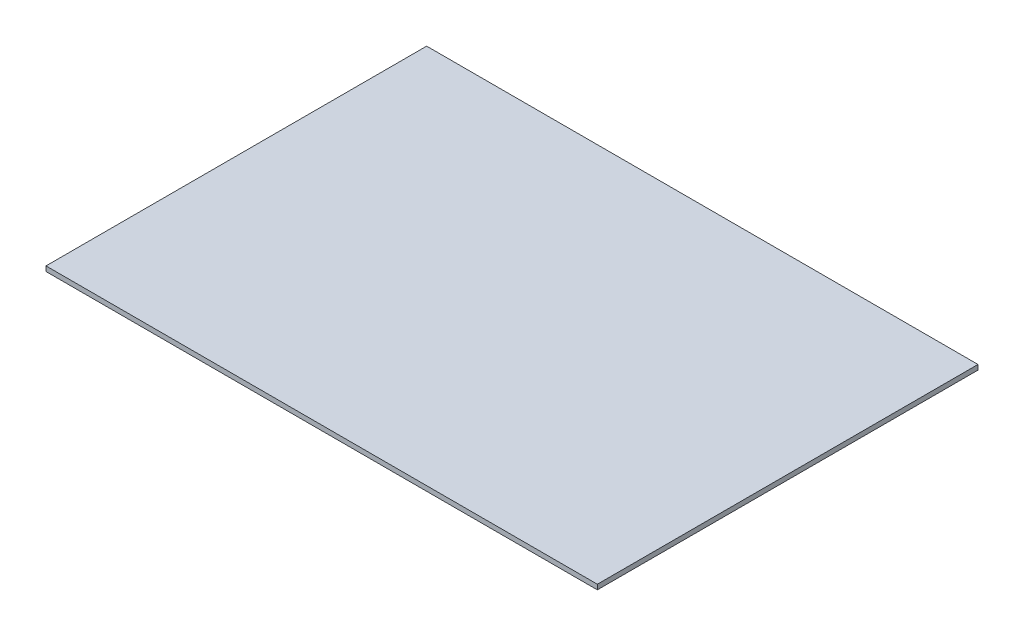
ISO-10303-21;
HEADER;
FILE_DESCRIPTION(('STEP AP214'),'2;1');
FILE_NAME('part.step','',(''),(''),'','','');
FILE_SCHEMA(('AUTOMOTIVE_DESIGN { 1 0 10303 214 1 1 1 1 }'));
ENDSEC;
DATA;
#1=APPLICATION_CONTEXT('core data for automotive mechanical design processes');
#2=APPLICATION_PROTOCOL_DEFINITION('international standard','automotive_design',2000,#1);
#3=PRODUCT_CONTEXT('',#1,'mechanical');
#4=PRODUCT('Part','Part','',(#3));
#5=PRODUCT_RELATED_PRODUCT_CATEGORY('part','',(#4));
#6=PRODUCT_DEFINITION_FORMATION('','',#4);
#7=PRODUCT_DEFINITION_CONTEXT('part definition',#1,'design');
#8=PRODUCT_DEFINITION('design','',#6,#7);
#9=PRODUCT_DEFINITION_SHAPE('','',#8);
#10=(LENGTH_UNIT() NAMED_UNIT(*) SI_UNIT(.MILLI.,.METRE.));
#11=(NAMED_UNIT(*) PLANE_ANGLE_UNIT() SI_UNIT($,.RADIAN.));
#12=(NAMED_UNIT(*) SI_UNIT($,.STERADIAN.) SOLID_ANGLE_UNIT());
#13=UNCERTAINTY_MEASURE_WITH_UNIT(LENGTH_MEASURE(1.E-05),#10,'distance_accuracy_value','');
#14=(GEOMETRIC_REPRESENTATION_CONTEXT(3) GLOBAL_UNCERTAINTY_ASSIGNED_CONTEXT((#13)) GLOBAL_UNIT_ASSIGNED_CONTEXT((#10,
#11,#12)) REPRESENTATION_CONTEXT('',''));
#15=CARTESIAN_POINT('',(0.,0.,0.));
#16=DIRECTION('',(0.,0.,1.));
#17=DIRECTION('',(1.,0.,0.));
#18=AXIS2_PLACEMENT_3D('',#15,#16,#17);
#19=CARTESIAN_POINT('',(140.5,2.5,97.));
#20=DIRECTION('',(-1.,0.,0.));
#21=DIRECTION('',(0.,0.,1.));
#22=AXIS2_PLACEMENT_3D('',#19,#20,#21);
#23=PLANE('',#22);
#24=DIRECTION('',(0.,0.,-1.));
#25=VECTOR('',#24,1.);
#26=CARTESIAN_POINT('',(140.5,0.,97.));
#27=LINE('',#26,#25);
#28=CARTESIAN_POINT('',(140.5,0.,97.));
#29=VERTEX_POINT('',#28);
#30=CARTESIAN_POINT('',(140.5,0.,-97.));
#31=VERTEX_POINT('',#30);
#32=EDGE_CURVE('E94',#29,#31,#27,.T.);
#33=ORIENTED_EDGE('',*,*,#32,.T.);
#34=DIRECTION('',(0.,-1.,0.));
#35=VECTOR('',#34,1.);
#36=CARTESIAN_POINT('',(140.5,2.5,-97.));
#37=LINE('',#36,#35);
#38=CARTESIAN_POINT('',(140.5,2.5,-97.));
#39=VERTEX_POINT('',#38);
#40=EDGE_CURVE('E11',#39,#31,#37,.T.);
#41=ORIENTED_EDGE('',*,*,#40,.F.);
#42=DIRECTION('',(0.,0.,-1.));
#43=VECTOR('',#42,1.);
#44=CARTESIAN_POINT('',(140.5,2.5,97.));
#45=LINE('',#44,#43);
#46=CARTESIAN_POINT('',(140.5,2.5,97.));
#47=VERTEX_POINT('',#46);
#48=EDGE_CURVE('E82',#47,#39,#45,.T.);
#49=ORIENTED_EDGE('',*,*,#48,.F.);
#50=DIRECTION('',(0.,-1.,0.));
#51=VECTOR('',#50,1.);
#52=CARTESIAN_POINT('',(140.5,2.5,97.));
#53=LINE('',#52,#51);
#54=EDGE_CURVE('E90',#47,#29,#53,.T.);
#55=ORIENTED_EDGE('',*,*,#54,.T.);
#56=EDGE_LOOP('',(#33,#41,#49,#55));
#57=FACE_BOUND('',#56,.T.);
#58=ADVANCED_FACE('F31',(#57),#23,.F.);
#59=CARTESIAN_POINT('',(-140.5,2.5,-97.));
#60=DIRECTION('',(0.,0.,1.));
#61=DIRECTION('',(1.,0.,0.));
#62=AXIS2_PLACEMENT_3D('',#59,#60,#61);
#63=PLANE('',#62);
#64=DIRECTION('',(-1.,0.,0.));
#65=VECTOR('',#64,1.);
#66=CARTESIAN_POINT('',(-140.5,0.,-97.));
#67=LINE('',#66,#65);
#68=CARTESIAN_POINT('',(-140.5,0.,-97.));
#69=VERTEX_POINT('',#68);
#70=EDGE_CURVE('E86',#31,#69,#67,.T.);
#71=ORIENTED_EDGE('',*,*,#70,.T.);
#72=DIRECTION('',(0.,-1.,0.));
#73=VECTOR('',#72,1.);
#74=CARTESIAN_POINT('',(-140.5,2.5,-97.));
#75=LINE('',#74,#73);
#76=CARTESIAN_POINT('',(-140.5,2.5,-97.));
#77=VERTEX_POINT('',#76);
#78=EDGE_CURVE('E39',#77,#69,#75,.T.);
#79=ORIENTED_EDGE('',*,*,#78,.F.);
#80=DIRECTION('',(-1.,0.,0.));
#81=VECTOR('',#80,1.);
#82=CARTESIAN_POINT('',(-140.5,2.5,-97.));
#83=LINE('',#82,#81);
#84=EDGE_CURVE('E77',#39,#77,#83,.T.);
#85=ORIENTED_EDGE('',*,*,#84,.F.);
#86=ORIENTED_EDGE('',*,*,#40,.T.);
#87=EDGE_LOOP('',(#71,#79,#85,#86));
#88=FACE_BOUND('',#87,.T.);
#89=ADVANCED_FACE('F85',(#88),#63,.F.);
#90=CARTESIAN_POINT('',(-140.5,2.5,97.));
#91=DIRECTION('',(1.,0.,0.));
#92=DIRECTION('',(0.,0.,-1.));
#93=AXIS2_PLACEMENT_3D('',#90,#91,#92);
#94=PLANE('',#93);
#95=DIRECTION('',(0.,0.,1.));
#96=VECTOR('',#95,1.);
#97=CARTESIAN_POINT('',(-140.5,0.,97.));
#98=LINE('',#97,#96);
#99=CARTESIAN_POINT('',(-140.5,0.,97.));
#100=VERTEX_POINT('',#99);
#101=EDGE_CURVE('E64',#69,#100,#98,.T.);
#102=ORIENTED_EDGE('',*,*,#101,.T.);
#103=DIRECTION('',(0.,-1.,0.));
#104=VECTOR('',#103,1.);
#105=CARTESIAN_POINT('',(-140.5,2.5,97.));
#106=LINE('',#105,#104);
#107=CARTESIAN_POINT('',(-140.5,2.5,97.));
#108=VERTEX_POINT('',#107);
#109=EDGE_CURVE('E87',#108,#100,#106,.T.);
#110=ORIENTED_EDGE('',*,*,#109,.F.);
#111=DIRECTION('',(0.,0.,1.));
#112=VECTOR('',#111,1.);
#113=CARTESIAN_POINT('',(-140.5,2.5,97.));
#114=LINE('',#113,#112);
#115=EDGE_CURVE('E80',#77,#108,#114,.T.);
#116=ORIENTED_EDGE('',*,*,#115,.F.);
#117=ORIENTED_EDGE('',*,*,#78,.T.);
#118=EDGE_LOOP('',(#102,#110,#116,#117));
#119=FACE_BOUND('',#118,.T.);
#120=ADVANCED_FACE('F88',(#119),#94,.F.);
#121=CARTESIAN_POINT('',(-140.5,2.5,97.));
#122=DIRECTION('',(0.,0.,-1.));
#123=DIRECTION('',(-1.,0.,0.));
#124=AXIS2_PLACEMENT_3D('',#121,#122,#123);
#125=PLANE('',#124);
#126=DIRECTION('',(1.,0.,0.));
#127=VECTOR('',#126,1.);
#128=CARTESIAN_POINT('',(-140.5,0.,97.));
#129=LINE('',#128,#127);
#130=EDGE_CURVE('E70',#100,#29,#129,.T.);
#131=ORIENTED_EDGE('',*,*,#130,.T.);
#132=ORIENTED_EDGE('',*,*,#54,.F.);
#133=DIRECTION('',(1.,0.,0.));
#134=VECTOR('',#133,1.);
#135=CARTESIAN_POINT('',(-140.5,2.5,97.));
#136=LINE('',#135,#134);
#137=EDGE_CURVE('E47',#108,#47,#136,.T.);
#138=ORIENTED_EDGE('',*,*,#137,.F.);
#139=ORIENTED_EDGE('',*,*,#109,.T.);
#140=EDGE_LOOP('',(#131,#132,#138,#139));
#141=FACE_BOUND('',#140,.T.);
#142=ADVANCED_FACE('F101',(#141),#125,.F.);
#143=CARTESIAN_POINT('',(140.5,2.5,-97.));
#144=DIRECTION('',(0.,-1.,0.));
#145=DIRECTION('',(0.,0.,-1.));
#146=AXIS2_PLACEMENT_3D('',#143,#144,#145);
#147=PLANE('',#146);
#148=ORIENTED_EDGE('',*,*,#48,.T.);
#149=ORIENTED_EDGE('',*,*,#84,.T.);
#150=ORIENTED_EDGE('',*,*,#115,.T.);
#151=ORIENTED_EDGE('',*,*,#137,.T.);
#152=EDGE_LOOP('',(#148,#149,#150,#151));
#153=FACE_BOUND('',#152,.T.);
#154=ADVANCED_FACE('F78',(#153),#147,.F.);
#155=CARTESIAN_POINT('',(140.5,0.,-97.));
#156=DIRECTION('',(0.,-1.,0.));
#157=DIRECTION('',(0.,0.,-1.));
#158=AXIS2_PLACEMENT_3D('',#155,#156,#157);
#159=PLANE('',#158);
#160=ORIENTED_EDGE('',*,*,#32,.F.);
#161=ORIENTED_EDGE('',*,*,#130,.F.);
#162=ORIENTED_EDGE('',*,*,#101,.F.);
#163=ORIENTED_EDGE('',*,*,#70,.F.);
#164=EDGE_LOOP('',(#160,#161,#162,#163));
#165=FACE_BOUND('',#164,.T.);
#166=ADVANCED_FACE('F104',(#165),#159,.T.);
#167=CLOSED_SHELL('',(#58,#89,#120,#142,#154,#166));
#168=MANIFOLD_SOLID_BREP('B2',#167);
#169=ADVANCED_BREP_SHAPE_REPRESENTATION('',(#18,#168),#14);
#170=SHAPE_DEFINITION_REPRESENTATION(#9,#169);
ENDSEC;
END-ISO-10303-21;
